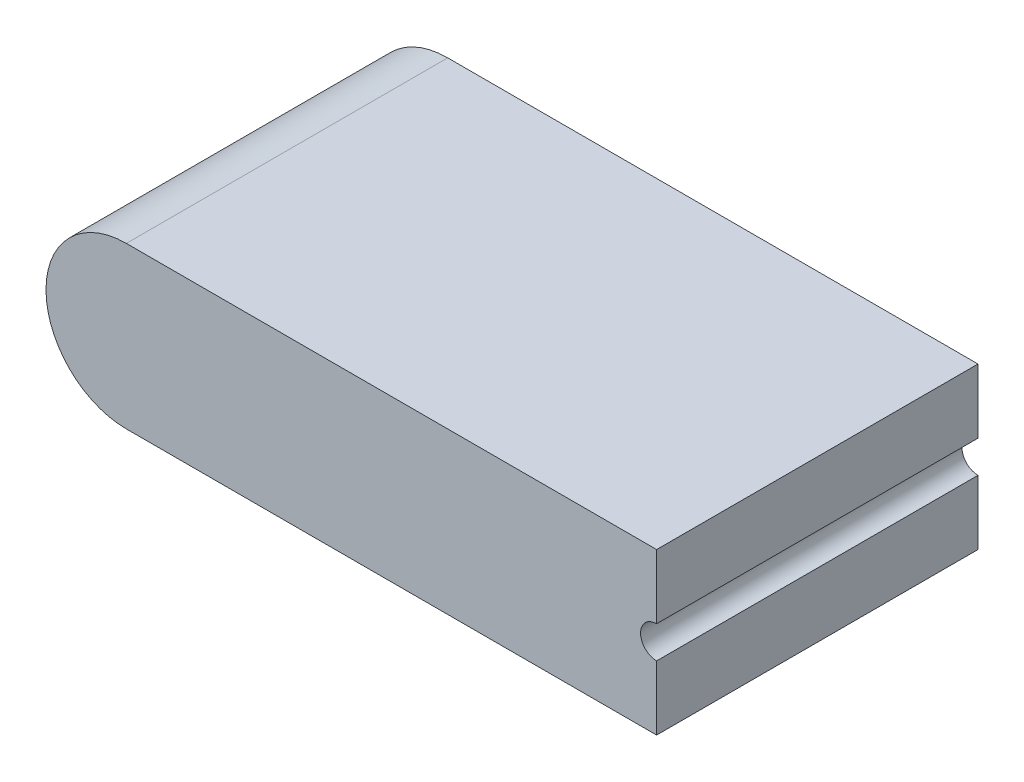
ISO-10303-21;
HEADER;
FILE_DESCRIPTION(('STEP AP214'),'2;1');
FILE_NAME('part.step','',(''),(''),'','','');
FILE_SCHEMA(('AUTOMOTIVE_DESIGN { 1 0 10303 214 1 1 1 1 }'));
ENDSEC;
DATA;
#1=APPLICATION_CONTEXT('core data for automotive mechanical design processes');
#2=APPLICATION_PROTOCOL_DEFINITION('international standard','automotive_design',2000,#1);
#3=PRODUCT_CONTEXT('',#1,'mechanical');
#4=PRODUCT('Part','Part','',(#3));
#5=PRODUCT_RELATED_PRODUCT_CATEGORY('part','',(#4));
#6=PRODUCT_DEFINITION_FORMATION('','',#4);
#7=PRODUCT_DEFINITION_CONTEXT('part definition',#1,'design');
#8=PRODUCT_DEFINITION('design','',#6,#7);
#9=PRODUCT_DEFINITION_SHAPE('','',#8);
#10=(LENGTH_UNIT() NAMED_UNIT(*) SI_UNIT(.MILLI.,.METRE.));
#11=(NAMED_UNIT(*) PLANE_ANGLE_UNIT() SI_UNIT($,.RADIAN.));
#12=(NAMED_UNIT(*) SI_UNIT($,.STERADIAN.) SOLID_ANGLE_UNIT());
#13=UNCERTAINTY_MEASURE_WITH_UNIT(LENGTH_MEASURE(1.E-05),#10,'distance_accuracy_value','');
#14=(GEOMETRIC_REPRESENTATION_CONTEXT(3) GLOBAL_UNCERTAINTY_ASSIGNED_CONTEXT((#13)) GLOBAL_UNIT_ASSIGNED_CONTEXT((#10,
#11,#12)) REPRESENTATION_CONTEXT('',''));
#15=CARTESIAN_POINT('',(0.,0.,0.));
#16=DIRECTION('',(0.,0.,1.));
#17=DIRECTION('',(1.,0.,0.));
#18=AXIS2_PLACEMENT_3D('',#15,#16,#17);
#19=CARTESIAN_POINT('',(6.35,2.54,0.));
#20=DIRECTION('',(-1.,0.,0.));
#21=DIRECTION('',(0.,0.,1.));
#22=AXIS2_PLACEMENT_3D('',#19,#20,#21);
#23=PLANE('',#22);
#24=DIRECTION('',(0.,-1.,0.));
#25=VECTOR('',#24,1.);
#26=CARTESIAN_POINT('',(6.35,2.54,-5.08));
#27=LINE('',#26,#25);
#28=CARTESIAN_POINT('',(6.35,1.01600000000001,-5.08));
#29=VERTEX_POINT('',#28);
#30=CARTESIAN_POINT('',(6.35,0.,-5.08));
#31=VERTEX_POINT('',#30);
#32=EDGE_CURVE('E142',#29,#31,#27,.T.);
#33=ORIENTED_EDGE('',*,*,#32,.F.);
#34=DIRECTION('',(0.,0.,1.));
#35=VECTOR('',#34,1.);
#36=CARTESIAN_POINT('',(6.35,1.01600000000001,0.));
#37=LINE('',#36,#35);
#38=CARTESIAN_POINT('',(6.35,1.01600000000001,0.));
#39=VERTEX_POINT('',#38);
#40=EDGE_CURVE('E47',#29,#39,#37,.T.);
#41=ORIENTED_EDGE('',*,*,#40,.T.);
#42=DIRECTION('',(0.,-1.,0.));
#43=VECTOR('',#42,1.);
#44=CARTESIAN_POINT('',(6.35,2.54,0.));
#45=LINE('',#44,#43);
#46=CARTESIAN_POINT('',(6.35,0.,0.));
#47=VERTEX_POINT('',#46);
#48=EDGE_CURVE('E106',#39,#47,#45,.T.);
#49=ORIENTED_EDGE('',*,*,#48,.T.);
#50=DIRECTION('',(0.,0.,-1.));
#51=VECTOR('',#50,1.);
#52=CARTESIAN_POINT('',(6.35,0.,0.));
#53=LINE('',#52,#51);
#54=EDGE_CURVE('E131',#47,#31,#53,.T.);
#55=ORIENTED_EDGE('',*,*,#54,.T.);
#56=EDGE_LOOP('',(#33,#41,#49,#55));
#57=FACE_BOUND('',#56,.T.);
#58=ADVANCED_FACE('F32',(#57),#23,.F.);
#59=CARTESIAN_POINT('',(0.,2.54,0.));
#60=DIRECTION('',(0.,0.,-1.));
#61=DIRECTION('',(-1.,0.,0.));
#62=AXIS2_PLACEMENT_3D('',#59,#60,#61);
#63=PLANE('',#62);
#64=ORIENTED_EDGE('',*,*,#48,.F.);
#65=CARTESIAN_POINT('',(6.35,1.27,0.));
#66=DIRECTION('',(0.,0.,1.));
#67=DIRECTION('',(1.,0.,0.));
#68=AXIS2_PLACEMENT_3D('',#65,#66,#67);
#69=CIRCLE('',#68,0.253999999999989);
#70=CARTESIAN_POINT('',(6.35,1.52399999999999,0.));
#71=VERTEX_POINT('',#70);
#72=EDGE_CURVE('E92',#71,#39,#69,.T.);
#73=ORIENTED_EDGE('',*,*,#72,.F.);
#74=CARTESIAN_POINT('',(6.35,2.54,0.));
#75=VERTEX_POINT('',#74);
#76=EDGE_CURVE('E103',#75,#71,#45,.T.);
#77=ORIENTED_EDGE('',*,*,#76,.F.);
#78=DIRECTION('',(1.,0.,0.));
#79=VECTOR('',#78,1.);
#80=CARTESIAN_POINT('',(-3.302,2.54,0.));
#81=LINE('',#80,#79);
#82=CARTESIAN_POINT('',(-2.032,2.54,0.));
#83=VERTEX_POINT('',#82);
#84=EDGE_CURVE('E137',#83,#75,#81,.T.);
#85=ORIENTED_EDGE('',*,*,#84,.F.);
#86=CARTESIAN_POINT('',(-2.032,1.27,0.));
#87=DIRECTION('',(0.,0.,-1.));
#88=DIRECTION('',(-1.,0.,0.));
#89=AXIS2_PLACEMENT_3D('',#86,#87,#88);
#90=CIRCLE('',#89,1.27);
#91=CARTESIAN_POINT('',(-3.302,1.27,0.));
#92=VERTEX_POINT('',#91);
#93=EDGE_CURVE('E110',#83,#92,#90,.F.);
#94=ORIENTED_EDGE('',*,*,#93,.T.);
#95=CARTESIAN_POINT('',(-2.032,1.27,0.));
#96=DIRECTION('',(0.,0.,-1.));
#97=DIRECTION('',(-1.,0.,0.));
#98=AXIS2_PLACEMENT_3D('',#95,#96,#97);
#99=CIRCLE('',#98,1.27);
#100=CARTESIAN_POINT('',(-2.032,0.,0.));
#101=VERTEX_POINT('',#100);
#102=EDGE_CURVE('E112',#92,#101,#99,.F.);
#103=ORIENTED_EDGE('',*,*,#102,.T.);
#104=DIRECTION('',(1.,0.,0.));
#105=VECTOR('',#104,1.);
#106=CARTESIAN_POINT('',(0.,0.,0.));
#107=LINE('',#106,#105);
#108=EDGE_CURVE('E127',#101,#47,#107,.T.);
#109=ORIENTED_EDGE('',*,*,#108,.T.);
#110=EDGE_LOOP('',(#64,#73,#77,#85,#94,#103,#109));
#111=FACE_BOUND('',#110,.T.);
#112=ADVANCED_FACE('F101',(#111),#63,.F.);
#113=ORIENTED_EDGE('',*,*,#76,.T.);
#114=DIRECTION('',(0.,0.,1.));
#115=VECTOR('',#114,1.);
#116=CARTESIAN_POINT('',(6.35,1.52399999999999,0.));
#117=LINE('',#116,#115);
#118=CARTESIAN_POINT('',(6.35,1.52399999999999,-5.08));
#119=VERTEX_POINT('',#118);
#120=EDGE_CURVE('E89',#71,#119,#117,.F.);
#121=ORIENTED_EDGE('',*,*,#120,.T.);
#122=CARTESIAN_POINT('',(6.35,2.54,-5.08));
#123=VERTEX_POINT('',#122);
#124=EDGE_CURVE('E114',#123,#119,#27,.T.);
#125=ORIENTED_EDGE('',*,*,#124,.F.);
#126=DIRECTION('',(0.,0.,-1.));
#127=VECTOR('',#126,1.);
#128=CARTESIAN_POINT('',(6.35,2.54,0.));
#129=LINE('',#128,#127);
#130=EDGE_CURVE('E109',#75,#123,#129,.T.);
#131=ORIENTED_EDGE('',*,*,#130,.F.);
#132=EDGE_LOOP('',(#113,#121,#125,#131));
#133=FACE_BOUND('',#132,.T.);
#134=ADVANCED_FACE('F108',(#133),#23,.F.);
#135=CARTESIAN_POINT('',(6.35,2.54,-5.08));
#136=DIRECTION('',(0.,0.,1.));
#137=DIRECTION('',(1.,0.,0.));
#138=AXIS2_PLACEMENT_3D('',#135,#136,#137);
#139=PLANE('',#138);
#140=ORIENTED_EDGE('',*,*,#124,.T.);
#141=CARTESIAN_POINT('',(6.35,1.27,-5.08));
#142=DIRECTION('',(0.,0.,1.));
#143=DIRECTION('',(1.,0.,0.));
#144=AXIS2_PLACEMENT_3D('',#141,#142,#143);
#145=CIRCLE('',#144,0.253999999999987);
#146=EDGE_CURVE('E11',#119,#29,#145,.T.);
#147=ORIENTED_EDGE('',*,*,#146,.T.);
#148=ORIENTED_EDGE('',*,*,#32,.T.);
#149=DIRECTION('',(-1.,0.,0.));
#150=VECTOR('',#149,1.);
#151=CARTESIAN_POINT('',(6.35,0.,-5.08));
#152=LINE('',#151,#150);
#153=CARTESIAN_POINT('',(-2.032,0.,-5.08));
#154=VERTEX_POINT('',#153);
#155=EDGE_CURVE('E139',#31,#154,#152,.T.);
#156=ORIENTED_EDGE('',*,*,#155,.T.);
#157=CARTESIAN_POINT('',(-2.032,1.27,-5.08));
#158=DIRECTION('',(0.,0.,1.));
#159=DIRECTION('',(1.,0.,0.));
#160=AXIS2_PLACEMENT_3D('',#157,#158,#159);
#161=CIRCLE('',#160,1.27);
#162=CARTESIAN_POINT('',(-3.302,1.27,-5.08));
#163=VERTEX_POINT('',#162);
#164=EDGE_CURVE('E123',#154,#163,#161,.F.);
#165=ORIENTED_EDGE('',*,*,#164,.T.);
#166=CARTESIAN_POINT('',(-2.032,1.27,-5.08));
#167=DIRECTION('',(0.,0.,1.));
#168=DIRECTION('',(1.,0.,0.));
#169=AXIS2_PLACEMENT_3D('',#166,#167,#168);
#170=CIRCLE('',#169,1.27);
#171=CARTESIAN_POINT('',(-2.032,2.54,-5.08));
#172=VERTEX_POINT('',#171);
#173=EDGE_CURVE('E54',#163,#172,#170,.F.);
#174=ORIENTED_EDGE('',*,*,#173,.T.);
#175=DIRECTION('',(-1.,0.,0.));
#176=VECTOR('',#175,1.);
#177=CARTESIAN_POINT('',(6.35,2.54,-5.08));
#178=LINE('',#177,#176);
#179=EDGE_CURVE('E141',#123,#172,#178,.T.);
#180=ORIENTED_EDGE('',*,*,#179,.F.);
#181=EDGE_LOOP('',(#140,#147,#148,#156,#165,#174,#180));
#182=FACE_BOUND('',#181,.T.);
#183=ADVANCED_FACE('F147',(#182),#139,.F.);
#184=CARTESIAN_POINT('',(0.,2.54,0.));
#185=DIRECTION('',(0.,1.,0.));
#186=DIRECTION('',(0.,0.,1.));
#187=AXIS2_PLACEMENT_3D('',#184,#185,#186);
#188=PLANE('',#187);
#189=ORIENTED_EDGE('',*,*,#179,.T.);
#190=DIRECTION('',(0.,0.,1.));
#191=VECTOR('',#190,1.);
#192=CARTESIAN_POINT('',(-2.032,2.54,0.));
#193=LINE('',#192,#191);
#194=EDGE_CURVE('E40',#172,#83,#193,.T.);
#195=ORIENTED_EDGE('',*,*,#194,.T.);
#196=ORIENTED_EDGE('',*,*,#84,.T.);
#197=ORIENTED_EDGE('',*,*,#130,.T.);
#198=EDGE_LOOP('',(#189,#195,#196,#197));
#199=FACE_BOUND('',#198,.T.);
#200=ADVANCED_FACE('F158',(#199),#188,.T.);
#201=CARTESIAN_POINT('',(0.,0.,0.));
#202=DIRECTION('',(0.,1.,0.));
#203=DIRECTION('',(0.,0.,1.));
#204=AXIS2_PLACEMENT_3D('',#201,#202,#203);
#205=PLANE('',#204);
#206=ORIENTED_EDGE('',*,*,#108,.F.);
#207=DIRECTION('',(0.,0.,1.));
#208=VECTOR('',#207,1.);
#209=CARTESIAN_POINT('',(-2.032,0.,0.));
#210=LINE('',#209,#208);
#211=EDGE_CURVE('E119',#101,#154,#210,.F.);
#212=ORIENTED_EDGE('',*,*,#211,.T.);
#213=ORIENTED_EDGE('',*,*,#155,.F.);
#214=ORIENTED_EDGE('',*,*,#54,.F.);
#215=EDGE_LOOP('',(#206,#212,#213,#214));
#216=FACE_BOUND('',#215,.T.);
#217=ADVANCED_FACE('F151',(#216),#205,.F.);
#218=CARTESIAN_POINT('',(-2.032,1.27,0.));
#219=DIRECTION('',(0.,0.,-1.));
#220=DIRECTION('',(-1.,0.,0.));
#221=AXIS2_PLACEMENT_3D('',#218,#219,#220);
#222=CYLINDRICAL_SURFACE('',#221,1.27);
#223=ORIENTED_EDGE('',*,*,#194,.F.);
#224=ORIENTED_EDGE('',*,*,#173,.F.);
#225=DIRECTION('',(0.,0.,1.));
#226=VECTOR('',#225,1.);
#227=CARTESIAN_POINT('',(-3.302,1.27,-5.08));
#228=LINE('',#227,#226);
#229=EDGE_CURVE('E125',#92,#163,#228,.F.);
#230=ORIENTED_EDGE('',*,*,#229,.F.);
#231=ORIENTED_EDGE('',*,*,#93,.F.);
#232=EDGE_LOOP('',(#223,#224,#230,#231));
#233=FACE_BOUND('',#232,.T.);
#234=ADVANCED_FACE('F34',(#233),#222,.T.);
#235=CARTESIAN_POINT('',(-2.032,1.27,-5.08));
#236=DIRECTION('',(0.,0.,1.));
#237=DIRECTION('',(1.,0.,0.));
#238=AXIS2_PLACEMENT_3D('',#235,#236,#237);
#239=CYLINDRICAL_SURFACE('',#238,1.27);
#240=ORIENTED_EDGE('',*,*,#164,.F.);
#241=ORIENTED_EDGE('',*,*,#211,.F.);
#242=ORIENTED_EDGE('',*,*,#102,.F.);
#243=ORIENTED_EDGE('',*,*,#229,.T.);
#244=EDGE_LOOP('',(#240,#241,#242,#243));
#245=FACE_BOUND('',#244,.T.);
#246=ADVANCED_FACE('F153',(#245),#239,.T.);
#247=CARTESIAN_POINT('',(6.35,1.27,0.));
#248=DIRECTION('',(0.,0.,1.));
#249=DIRECTION('',(1.,0.,0.));
#250=AXIS2_PLACEMENT_3D('',#247,#248,#249);
#251=CYLINDRICAL_SURFACE('',#250,0.253999999999987);
#252=ORIENTED_EDGE('',*,*,#146,.F.);
#253=ORIENTED_EDGE('',*,*,#120,.F.);
#254=ORIENTED_EDGE('',*,*,#72,.T.);
#255=ORIENTED_EDGE('',*,*,#40,.F.);
#256=EDGE_LOOP('',(#252,#253,#254,#255));
#257=FACE_BOUND('',#256,.T.);
#258=ADVANCED_FACE('F91',(#257),#251,.F.);
#259=CLOSED_SHELL('',(#58,#112,#134,#183,#200,#217,#234,#246,#258));
#260=MANIFOLD_SOLID_BREP('B2',#259);
#261=ADVANCED_BREP_SHAPE_REPRESENTATION('',(#18,#260),#14);
#262=SHAPE_DEFINITION_REPRESENTATION(#9,#261);
ENDSEC;
END-ISO-10303-21;
